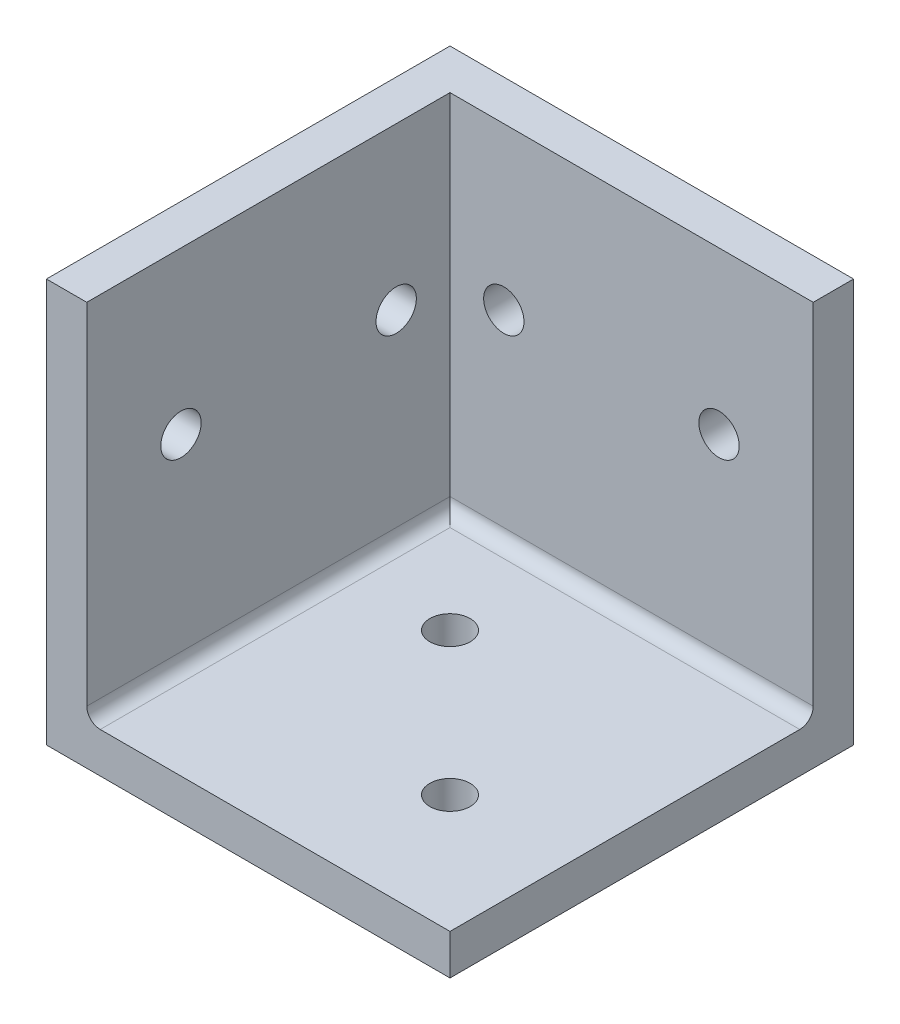
ISO-10303-21;
HEADER;
FILE_DESCRIPTION(('STEP AP214'),'2;1');
FILE_NAME('part.step','',(''),(''),'','','');
FILE_SCHEMA(('AUTOMOTIVE_DESIGN { 1 0 10303 214 1 1 1 1 }'));
ENDSEC;
DATA;
#1=APPLICATION_CONTEXT('core data for automotive mechanical design processes');
#2=APPLICATION_PROTOCOL_DEFINITION('international standard','automotive_design',2000,#1);
#3=PRODUCT_CONTEXT('',#1,'mechanical');
#4=PRODUCT('Part','Part','',(#3));
#5=PRODUCT_RELATED_PRODUCT_CATEGORY('part','',(#4));
#6=PRODUCT_DEFINITION_FORMATION('','',#4);
#7=PRODUCT_DEFINITION_CONTEXT('part definition',#1,'design');
#8=PRODUCT_DEFINITION('design','',#6,#7);
#9=PRODUCT_DEFINITION_SHAPE('','',#8);
#10=(LENGTH_UNIT() NAMED_UNIT(*) SI_UNIT(.MILLI.,.METRE.));
#11=(NAMED_UNIT(*) PLANE_ANGLE_UNIT() SI_UNIT($,.RADIAN.));
#12=(NAMED_UNIT(*) SI_UNIT($,.STERADIAN.) SOLID_ANGLE_UNIT());
#13=UNCERTAINTY_MEASURE_WITH_UNIT(LENGTH_MEASURE(1.E-05),#10,'distance_accuracy_value','');
#14=(GEOMETRIC_REPRESENTATION_CONTEXT(3) GLOBAL_UNCERTAINTY_ASSIGNED_CONTEXT((#13)) GLOBAL_UNIT_ASSIGNED_CONTEXT((#10,
#11,#12)) REPRESENTATION_CONTEXT('',''));
#15=CARTESIAN_POINT('',(0.,0.,0.));
#16=DIRECTION('',(0.,0.,1.));
#17=DIRECTION('',(1.,0.,0.));
#18=AXIS2_PLACEMENT_3D('',#15,#16,#17);
#19=CARTESIAN_POINT('',(-15.,-15.,3.));
#20=DIRECTION('',(1.,0.,0.));
#21=DIRECTION('',(0.,0.,-1.));
#22=AXIS2_PLACEMENT_3D('',#19,#20,#21);
#23=PLANE('',#22);
#24=CARTESIAN_POINT('',(-15.,2.99999999999999,23.));
#25=DIRECTION('',(-1.,0.,0.));
#26=DIRECTION('',(0.,0.,1.));
#27=AXIS2_PLACEMENT_3D('',#24,#25,#26);
#28=CIRCLE('',#27,1.5);
#29=CARTESIAN_POINT('',(-15.,2.99999999999999,24.5));
#30=VERTEX_POINT('',#29);
#31=EDGE_CURVE('E473',#30,#30,#28,.T.);
#32=ORIENTED_EDGE('',*,*,#31,.F.);
#33=EDGE_LOOP('',(#32));
#34=FACE_BOUND('',#33,.T.);
#35=CARTESIAN_POINT('',(-15.,2.99999999999999,7.));
#36=DIRECTION('',(-1.,0.,0.));
#37=DIRECTION('',(0.,0.,-1.));
#38=AXIS2_PLACEMENT_3D('',#35,#36,#37);
#39=CIRCLE('',#38,1.5);
#40=CARTESIAN_POINT('',(-15.,2.99999999999999,5.5));
#41=VERTEX_POINT('',#40);
#42=EDGE_CURVE('E478',#41,#41,#39,.T.);
#43=ORIENTED_EDGE('',*,*,#42,.F.);
#44=EDGE_LOOP('',(#43));
#45=FACE_BOUND('',#44,.T.);
#46=DIRECTION('',(0.,-1.,0.));
#47=VECTOR('',#46,1.);
#48=CARTESIAN_POINT('',(-15.,-15.,0.));
#49=LINE('',#48,#47);
#50=CARTESIAN_POINT('',(-15.,15.,0.));
#51=VERTEX_POINT('',#50);
#52=CARTESIAN_POINT('',(-15.,-15.,0.));
#53=VERTEX_POINT('',#52);
#54=EDGE_CURVE('E160',#51,#53,#49,.T.);
#55=ORIENTED_EDGE('',*,*,#54,.T.);
#56=DIRECTION('',(0.,0.,-1.));
#57=VECTOR('',#56,1.);
#58=CARTESIAN_POINT('',(-15.,-15.,3.));
#59=LINE('',#58,#57);
#60=CARTESIAN_POINT('',(-15.,-15.,30.));
#61=VERTEX_POINT('',#60);
#62=EDGE_CURVE('E200',#61,#53,#59,.T.);
#63=ORIENTED_EDGE('',*,*,#62,.F.);
#64=DIRECTION('',(0.,-1.,0.));
#65=VECTOR('',#64,1.);
#66=CARTESIAN_POINT('',(-15.,-15.,30.));
#67=LINE('',#66,#65);
#68=CARTESIAN_POINT('',(-15.,15.,30.));
#69=VERTEX_POINT('',#68);
#70=EDGE_CURVE('E139',#69,#61,#67,.T.);
#71=ORIENTED_EDGE('',*,*,#70,.F.);
#72=DIRECTION('',(0.,0.,-1.));
#73=VECTOR('',#72,1.);
#74=CARTESIAN_POINT('',(-15.,15.,3.));
#75=LINE('',#74,#73);
#76=EDGE_CURVE('E127',#69,#51,#75,.T.);
#77=ORIENTED_EDGE('',*,*,#76,.T.);
#78=EDGE_LOOP('',(#55,#63,#71,#77));
#79=FACE_BOUND('',#78,.T.);
#80=ADVANCED_FACE('F42',(#34,#45,#79),#23,.F.);
#81=CARTESIAN_POINT('',(15.,-15.,3.));
#82=DIRECTION('',(0.,1.,0.));
#83=DIRECTION('',(-1.,0.,0.));
#84=AXIS2_PLACEMENT_3D('',#81,#82,#83);
#85=PLANE('',#84);
#86=CARTESIAN_POINT('',(-4.39339828220178,-15.,10.6066017177982));
#87=DIRECTION('',(0.,-1.,0.));
#88=DIRECTION('',(1.,0.,0.));
#89=AXIS2_PLACEMENT_3D('',#86,#87,#88);
#90=CIRCLE('',#89,1.5);
#91=CARTESIAN_POINT('',(-2.89339828220178,-15.,10.6066017177982));
#92=VERTEX_POINT('',#91);
#93=EDGE_CURVE('E456',#92,#92,#90,.T.);
#94=ORIENTED_EDGE('',*,*,#93,.F.);
#95=EDGE_LOOP('',(#94));
#96=FACE_BOUND('',#95,.T.);
#97=CARTESIAN_POINT('',(6.21320343559642,-15.,21.2132034355964));
#98=DIRECTION('',(0.,-1.,0.));
#99=DIRECTION('',(1.,0.,0.));
#100=AXIS2_PLACEMENT_3D('',#97,#98,#99);
#101=CIRCLE('',#100,1.5);
#102=CARTESIAN_POINT('',(7.71320343559642,-15.,21.2132034355964));
#103=VERTEX_POINT('',#102);
#104=EDGE_CURVE('E458',#103,#103,#101,.T.);
#105=ORIENTED_EDGE('',*,*,#104,.F.);
#106=EDGE_LOOP('',(#105));
#107=FACE_BOUND('',#106,.T.);
#108=DIRECTION('',(0.,0.,-1.));
#109=VECTOR('',#108,1.);
#110=CARTESIAN_POINT('',(15.,-15.,3.));
#111=LINE('',#110,#109);
#112=CARTESIAN_POINT('',(15.,-15.,30.));
#113=VERTEX_POINT('',#112);
#114=CARTESIAN_POINT('',(15.,-15.,0.));
#115=VERTEX_POINT('',#114);
#116=EDGE_CURVE('E196',#113,#115,#111,.T.);
#117=ORIENTED_EDGE('',*,*,#116,.F.);
#118=DIRECTION('',(1.,0.,0.));
#119=VECTOR('',#118,1.);
#120=CARTESIAN_POINT('',(-15.,-15.,30.));
#121=LINE('',#120,#119);
#122=EDGE_CURVE('E142',#61,#113,#121,.T.);
#123=ORIENTED_EDGE('',*,*,#122,.F.);
#124=ORIENTED_EDGE('',*,*,#62,.T.);
#125=DIRECTION('',(1.,0.,0.));
#126=VECTOR('',#125,1.);
#127=CARTESIAN_POINT('',(15.,-15.,0.));
#128=LINE('',#127,#126);
#129=EDGE_CURVE('E182',#53,#115,#128,.T.);
#130=ORIENTED_EDGE('',*,*,#129,.T.);
#131=EDGE_LOOP('',(#117,#123,#124,#130));
#132=FACE_BOUND('',#131,.T.);
#133=ADVANCED_FACE('F243',(#96,#107,#132),#85,.F.);
#134=CARTESIAN_POINT('',(15.,-15.,3.));
#135=DIRECTION('',(-1.,0.,0.));
#136=DIRECTION('',(0.,0.,1.));
#137=AXIS2_PLACEMENT_3D('',#134,#135,#136);
#138=PLANE('',#137);
#139=DIRECTION('',(0.,1.,0.));
#140=VECTOR('',#139,1.);
#141=CARTESIAN_POINT('',(15.,-15.,0.));
#142=LINE('',#141,#140);
#143=CARTESIAN_POINT('',(15.,15.,0.));
#144=VERTEX_POINT('',#143);
#145=EDGE_CURVE('E185',#115,#144,#142,.T.);
#146=ORIENTED_EDGE('',*,*,#145,.T.);
#147=DIRECTION('',(0.,0.,-1.));
#148=VECTOR('',#147,1.);
#149=CARTESIAN_POINT('',(15.,15.,3.));
#150=LINE('',#149,#148);
#151=CARTESIAN_POINT('',(15.,15.,3.));
#152=VERTEX_POINT('',#151);
#153=EDGE_CURVE('E192',#152,#144,#150,.T.);
#154=ORIENTED_EDGE('',*,*,#153,.F.);
#155=DIRECTION('',(0.,1.,0.));
#156=VECTOR('',#155,1.);
#157=CARTESIAN_POINT('',(15.,-15.,3.));
#158=LINE('',#157,#156);
#159=CARTESIAN_POINT('',(15.,-11.,3.));
#160=VERTEX_POINT('',#159);
#161=EDGE_CURVE('E172',#160,#152,#158,.T.);
#162=ORIENTED_EDGE('',*,*,#161,.F.);
#163=CARTESIAN_POINT('',(15.,-11.,4.));
#164=DIRECTION('',(-1.,0.,0.));
#165=DIRECTION('',(0.,0.,1.));
#166=AXIS2_PLACEMENT_3D('',#163,#164,#165);
#167=CIRCLE('',#166,1.);
#168=CARTESIAN_POINT('',(15.,-12.,4.));
#169=VERTEX_POINT('',#168);
#170=EDGE_CURVE('E52',#160,#169,#167,.T.);
#171=ORIENTED_EDGE('',*,*,#170,.T.);
#172=DIRECTION('',(0.,0.,-1.));
#173=VECTOR('',#172,1.);
#174=CARTESIAN_POINT('',(15.,-12.,30.));
#175=LINE('',#174,#173);
#176=CARTESIAN_POINT('',(15.,-12.,30.));
#177=VERTEX_POINT('',#176);
#178=EDGE_CURVE('E151',#177,#169,#175,.T.);
#179=ORIENTED_EDGE('',*,*,#178,.F.);
#180=DIRECTION('',(0.,1.,0.));
#181=VECTOR('',#180,1.);
#182=CARTESIAN_POINT('',(15.,-15.,30.));
#183=LINE('',#182,#181);
#184=EDGE_CURVE('E145',#113,#177,#183,.T.);
#185=ORIENTED_EDGE('',*,*,#184,.F.);
#186=ORIENTED_EDGE('',*,*,#116,.T.);
#187=EDGE_LOOP('',(#146,#154,#162,#171,#179,#185,#186));
#188=FACE_BOUND('',#187,.T.);
#189=ADVANCED_FACE('F220',(#188),#138,.F.);
#190=CARTESIAN_POINT('',(15.,15.,3.));
#191=DIRECTION('',(0.,-1.,0.));
#192=DIRECTION('',(1.,0.,0.));
#193=AXIS2_PLACEMENT_3D('',#190,#191,#192);
#194=PLANE('',#193);
#195=DIRECTION('',(-1.,0.,0.));
#196=VECTOR('',#195,1.);
#197=CARTESIAN_POINT('',(15.,15.,0.));
#198=LINE('',#197,#196);
#199=EDGE_CURVE('E176',#144,#51,#198,.T.);
#200=ORIENTED_EDGE('',*,*,#199,.T.);
#201=ORIENTED_EDGE('',*,*,#76,.F.);
#202=DIRECTION('',(-1.,0.,0.));
#203=VECTOR('',#202,1.);
#204=CARTESIAN_POINT('',(-12.,15.,30.));
#205=LINE('',#204,#203);
#206=CARTESIAN_POINT('',(-12.,15.,30.));
#207=VERTEX_POINT('',#206);
#208=EDGE_CURVE('E114',#207,#69,#205,.T.);
#209=ORIENTED_EDGE('',*,*,#208,.F.);
#210=DIRECTION('',(0.,0.,-1.));
#211=VECTOR('',#210,1.);
#212=CARTESIAN_POINT('',(-12.,15.,0.));
#213=LINE('',#212,#211);
#214=CARTESIAN_POINT('',(-12.,15.,3.));
#215=VERTEX_POINT('',#214);
#216=EDGE_CURVE('E119',#207,#215,#213,.T.);
#217=ORIENTED_EDGE('',*,*,#216,.T.);
#218=DIRECTION('',(-1.,0.,0.));
#219=VECTOR('',#218,1.);
#220=CARTESIAN_POINT('',(15.,15.,3.));
#221=LINE('',#220,#219);
#222=EDGE_CURVE('E175',#152,#215,#221,.T.);
#223=ORIENTED_EDGE('',*,*,#222,.F.);
#224=ORIENTED_EDGE('',*,*,#153,.T.);
#225=EDGE_LOOP('',(#200,#201,#209,#217,#223,#224));
#226=FACE_BOUND('',#225,.T.);
#227=ADVANCED_FACE('F123',(#226),#194,.F.);
#228=CARTESIAN_POINT('',(0.,0.,3.));
#229=DIRECTION('',(0.,0.,1.));
#230=DIRECTION('',(1.,0.,0.));
#231=AXIS2_PLACEMENT_3D('',#228,#229,#230);
#232=PLANE('',#231);
#233=DIRECTION('',(0.,1.,0.));
#234=VECTOR('',#233,1.);
#235=CARTESIAN_POINT('',(-12.,0.,3.));
#236=LINE('',#235,#234);
#237=CARTESIAN_POINT('',(-12.,-11.,3.));
#238=VERTEX_POINT('',#237);
#239=EDGE_CURVE('E130',#238,#215,#236,.T.);
#240=ORIENTED_EDGE('',*,*,#239,.F.);
#241=DIRECTION('',(-1.,0.,0.));
#242=VECTOR('',#241,1.);
#243=CARTESIAN_POINT('',(0.,-11.,3.));
#244=LINE('',#243,#242);
#245=EDGE_CURVE('E65',#238,#160,#244,.F.);
#246=ORIENTED_EDGE('',*,*,#245,.T.);
#247=ORIENTED_EDGE('',*,*,#161,.T.);
#248=ORIENTED_EDGE('',*,*,#222,.T.);
#249=EDGE_LOOP('',(#240,#246,#247,#248));
#250=FACE_BOUND('',#249,.T.);
#251=CARTESIAN_POINT('',(8.,3.,3.));
#252=DIRECTION('',(0.,0.,1.));
#253=DIRECTION('',(1.,0.,0.));
#254=AXIS2_PLACEMENT_3D('',#251,#252,#253);
#255=CIRCLE('',#254,1.5);
#256=CARTESIAN_POINT('',(9.5,3.,3.));
#257=VERTEX_POINT('',#256);
#258=EDGE_CURVE('E161',#257,#257,#255,.T.);
#259=ORIENTED_EDGE('',*,*,#258,.F.);
#260=EDGE_LOOP('',(#259));
#261=FACE_BOUND('',#260,.T.);
#262=CARTESIAN_POINT('',(-8.,3.,3.));
#263=DIRECTION('',(0.,0.,1.));
#264=DIRECTION('',(-1.,0.,0.));
#265=AXIS2_PLACEMENT_3D('',#262,#263,#264);
#266=CIRCLE('',#265,1.5);
#267=CARTESIAN_POINT('',(-9.5,3.,3.));
#268=VERTEX_POINT('',#267);
#269=EDGE_CURVE('E165',#268,#268,#266,.T.);
#270=ORIENTED_EDGE('',*,*,#269,.F.);
#271=EDGE_LOOP('',(#270));
#272=FACE_BOUND('',#271,.T.);
#273=ADVANCED_FACE('F290',(#250,#261,#272),#232,.T.);
#274=CARTESIAN_POINT('',(0.,0.,0.));
#275=DIRECTION('',(0.,0.,1.));
#276=DIRECTION('',(1.,0.,0.));
#277=AXIS2_PLACEMENT_3D('',#274,#275,#276);
#278=PLANE('',#277);
#279=CARTESIAN_POINT('',(8.,3.,0.));
#280=DIRECTION('',(0.,0.,1.));
#281=DIRECTION('',(1.,0.,0.));
#282=AXIS2_PLACEMENT_3D('',#279,#280,#281);
#283=CIRCLE('',#282,1.5);
#284=CARTESIAN_POINT('',(9.5,3.,0.));
#285=VERTEX_POINT('',#284);
#286=EDGE_CURVE('E156',#285,#285,#283,.T.);
#287=ORIENTED_EDGE('',*,*,#286,.T.);
#288=EDGE_LOOP('',(#287));
#289=FACE_BOUND('',#288,.T.);
#290=CARTESIAN_POINT('',(-8.,3.,0.));
#291=DIRECTION('',(0.,0.,1.));
#292=DIRECTION('',(-1.,0.,0.));
#293=AXIS2_PLACEMENT_3D('',#290,#291,#292);
#294=CIRCLE('',#293,1.5);
#295=CARTESIAN_POINT('',(-9.5,3.,0.));
#296=VERTEX_POINT('',#295);
#297=EDGE_CURVE('E155',#296,#296,#294,.T.);
#298=ORIENTED_EDGE('',*,*,#297,.T.);
#299=EDGE_LOOP('',(#298));
#300=FACE_BOUND('',#299,.T.);
#301=ORIENTED_EDGE('',*,*,#145,.F.);
#302=ORIENTED_EDGE('',*,*,#129,.F.);
#303=ORIENTED_EDGE('',*,*,#54,.F.);
#304=ORIENTED_EDGE('',*,*,#199,.F.);
#305=EDGE_LOOP('',(#301,#302,#303,#304));
#306=FACE_BOUND('',#305,.T.);
#307=ADVANCED_FACE('F240',(#289,#300,#306),#278,.F.);
#308=CARTESIAN_POINT('',(-8.,3.,0.));
#309=DIRECTION('',(0.,0.,1.));
#310=DIRECTION('',(1.,0.,0.));
#311=AXIS2_PLACEMENT_3D('',#308,#309,#310);
#312=CYLINDRICAL_SURFACE('',#311,1.5);
#313=ORIENTED_EDGE('',*,*,#297,.F.);
#314=EDGE_LOOP('',(#313));
#315=FACE_BOUND('',#314,.T.);
#316=ORIENTED_EDGE('',*,*,#269,.T.);
#317=EDGE_LOOP('',(#316));
#318=FACE_BOUND('',#317,.T.);
#319=ADVANCED_FACE('F285',(#315,#318),#312,.F.);
#320=CARTESIAN_POINT('',(8.,3.,0.));
#321=DIRECTION('',(0.,0.,1.));
#322=DIRECTION('',(1.,0.,0.));
#323=AXIS2_PLACEMENT_3D('',#320,#321,#322);
#324=CYLINDRICAL_SURFACE('',#323,1.5);
#325=ORIENTED_EDGE('',*,*,#286,.F.);
#326=EDGE_LOOP('',(#325));
#327=FACE_BOUND('',#326,.T.);
#328=ORIENTED_EDGE('',*,*,#258,.T.);
#329=EDGE_LOOP('',(#328));
#330=FACE_BOUND('',#329,.T.);
#331=ADVANCED_FACE('F281',(#327,#330),#324,.F.);
#332=CARTESIAN_POINT('',(-15.,-12.,30.));
#333=DIRECTION('',(0.,-1.,0.));
#334=DIRECTION('',(0.,0.,-1.));
#335=AXIS2_PLACEMENT_3D('',#332,#333,#334);
#336=PLANE('',#335);
#337=CARTESIAN_POINT('',(-4.39339828220178,-12.,10.6066017177982));
#338=DIRECTION('',(0.,-1.,0.));
#339=DIRECTION('',(1.,0.,0.));
#340=AXIS2_PLACEMENT_3D('',#337,#338,#339);
#341=CIRCLE('',#340,1.5);
#342=CARTESIAN_POINT('',(-2.89339828220178,-12.,10.6066017177982));
#343=VERTEX_POINT('',#342);
#344=EDGE_CURVE('E233',#343,#343,#341,.T.);
#345=ORIENTED_EDGE('',*,*,#344,.T.);
#346=EDGE_LOOP('',(#345));
#347=FACE_BOUND('',#346,.T.);
#348=CARTESIAN_POINT('',(6.21320343559642,-12.,21.2132034355964));
#349=DIRECTION('',(0.,-1.,0.));
#350=DIRECTION('',(1.,0.,0.));
#351=AXIS2_PLACEMENT_3D('',#348,#349,#350);
#352=CIRCLE('',#351,1.5);
#353=CARTESIAN_POINT('',(7.71320343559642,-12.,21.2132034355964));
#354=VERTEX_POINT('',#353);
#355=EDGE_CURVE('E464',#354,#354,#352,.T.);
#356=ORIENTED_EDGE('',*,*,#355,.T.);
#357=EDGE_LOOP('',(#356));
#358=FACE_BOUND('',#357,.T.);
#359=ORIENTED_EDGE('',*,*,#178,.T.);
#360=DIRECTION('',(-1.,0.,0.));
#361=VECTOR('',#360,1.);
#362=CARTESIAN_POINT('',(-15.,-12.,4.));
#363=LINE('',#362,#361);
#364=CARTESIAN_POINT('',(-11.,-12.,4.));
#365=VERTEX_POINT('',#364);
#366=EDGE_CURVE('E207',#169,#365,#363,.T.);
#367=ORIENTED_EDGE('',*,*,#366,.T.);
#368=DIRECTION('',(0.,0.,1.));
#369=VECTOR('',#368,1.);
#370=CARTESIAN_POINT('',(-11.,-12.,30.));
#371=LINE('',#370,#369);
#372=CARTESIAN_POINT('',(-11.,-12.,30.));
#373=VERTEX_POINT('',#372);
#374=EDGE_CURVE('E204',#365,#373,#371,.T.);
#375=ORIENTED_EDGE('',*,*,#374,.T.);
#376=DIRECTION('',(-1.,0.,0.));
#377=VECTOR('',#376,1.);
#378=CARTESIAN_POINT('',(-15.,-12.,30.));
#379=LINE('',#378,#377);
#380=EDGE_CURVE('E148',#177,#373,#379,.T.);
#381=ORIENTED_EDGE('',*,*,#380,.F.);
#382=EDGE_LOOP('',(#359,#367,#375,#381));
#383=FACE_BOUND('',#382,.T.);
#384=ADVANCED_FACE('F227',(#347,#358,#383),#336,.F.);
#385=CARTESIAN_POINT('',(0.,0.,30.));
#386=DIRECTION('',(0.,0.,-1.));
#387=DIRECTION('',(-1.,0.,0.));
#388=AXIS2_PLACEMENT_3D('',#385,#386,#387);
#389=PLANE('',#388);
#390=ORIENTED_EDGE('',*,*,#380,.T.);
#391=CARTESIAN_POINT('',(-11.,-11.,30.));
#392=DIRECTION('',(0.,0.,-1.));
#393=DIRECTION('',(-1.,0.,0.));
#394=AXIS2_PLACEMENT_3D('',#391,#392,#393);
#395=CIRCLE('',#394,1.);
#396=CARTESIAN_POINT('',(-12.,-11.,30.));
#397=VERTEX_POINT('',#396);
#398=EDGE_CURVE('E11',#373,#397,#395,.T.);
#399=ORIENTED_EDGE('',*,*,#398,.T.);
#400=DIRECTION('',(0.,1.,0.));
#401=VECTOR('',#400,1.);
#402=CARTESIAN_POINT('',(-12.,-15.,30.));
#403=LINE('',#402,#401);
#404=EDGE_CURVE('E110',#397,#207,#403,.T.);
#405=ORIENTED_EDGE('',*,*,#404,.T.);
#406=ORIENTED_EDGE('',*,*,#208,.T.);
#407=ORIENTED_EDGE('',*,*,#70,.T.);
#408=ORIENTED_EDGE('',*,*,#122,.T.);
#409=ORIENTED_EDGE('',*,*,#184,.T.);
#410=EDGE_LOOP('',(#390,#399,#405,#406,#407,#408,#409));
#411=FACE_BOUND('',#410,.T.);
#412=ADVANCED_FACE('F112',(#411),#389,.F.);
#413=CARTESIAN_POINT('',(-12.,0.,0.));
#414=DIRECTION('',(1.,0.,0.));
#415=DIRECTION('',(0.,0.,-1.));
#416=AXIS2_PLACEMENT_3D('',#413,#414,#415);
#417=PLANE('',#416);
#418=CARTESIAN_POINT('',(-12.,2.99999999999999,23.));
#419=DIRECTION('',(-1.,0.,0.));
#420=DIRECTION('',(0.,0.,1.));
#421=AXIS2_PLACEMENT_3D('',#418,#419,#420);
#422=CIRCLE('',#421,1.5);
#423=CARTESIAN_POINT('',(-12.,2.99999999999999,24.5));
#424=VERTEX_POINT('',#423);
#425=EDGE_CURVE('E469',#424,#424,#422,.T.);
#426=ORIENTED_EDGE('',*,*,#425,.T.);
#427=EDGE_LOOP('',(#426));
#428=FACE_BOUND('',#427,.T.);
#429=CARTESIAN_POINT('',(-12.,2.99999999999999,7.));
#430=DIRECTION('',(-1.,0.,0.));
#431=DIRECTION('',(0.,0.,-1.));
#432=AXIS2_PLACEMENT_3D('',#429,#430,#431);
#433=CIRCLE('',#432,1.5);
#434=CARTESIAN_POINT('',(-12.,2.99999999999999,5.5));
#435=VERTEX_POINT('',#434);
#436=EDGE_CURVE('E483',#435,#435,#433,.T.);
#437=ORIENTED_EDGE('',*,*,#436,.T.);
#438=EDGE_LOOP('',(#437));
#439=FACE_BOUND('',#438,.T.);
#440=ORIENTED_EDGE('',*,*,#404,.F.);
#441=DIRECTION('',(0.,0.,1.));
#442=VECTOR('',#441,1.);
#443=CARTESIAN_POINT('',(-12.,-11.,0.));
#444=LINE('',#443,#442);
#445=EDGE_CURVE('E213',#397,#238,#444,.F.);
#446=ORIENTED_EDGE('',*,*,#445,.T.);
#447=ORIENTED_EDGE('',*,*,#239,.T.);
#448=ORIENTED_EDGE('',*,*,#216,.F.);
#449=EDGE_LOOP('',(#440,#446,#447,#448));
#450=FACE_BOUND('',#449,.T.);
#451=ADVANCED_FACE('F132',(#428,#439,#450),#417,.T.);
#452=CARTESIAN_POINT('',(-11.,-11.,30.));
#453=DIRECTION('',(0.,0.,1.));
#454=DIRECTION('',(1.,0.,0.));
#455=AXIS2_PLACEMENT_3D('',#452,#453,#454);
#456=CYLINDRICAL_SURFACE('',#455,1.);
#457=ORIENTED_EDGE('',*,*,#398,.F.);
#458=ORIENTED_EDGE('',*,*,#374,.F.);
#459=CARTESIAN_POINT('',(-11.,-11.,4.));
#460=DIRECTION('',(-0.707106781186547,0.,0.707106781186547));
#461=DIRECTION('',(-0.707106781186547,0.,-0.707106781186547));
#462=AXIS2_PLACEMENT_3D('',#459,#460,#461);
#463=ELLIPSE('',#462,1.41421356237309,1.);
#464=EDGE_CURVE('E46',#238,#365,#463,.T.);
#465=ORIENTED_EDGE('',*,*,#464,.F.);
#466=ORIENTED_EDGE('',*,*,#445,.F.);
#467=EDGE_LOOP('',(#457,#458,#465,#466));
#468=FACE_BOUND('',#467,.T.);
#469=ADVANCED_FACE('F44',(#468),#456,.F.);
#470=CARTESIAN_POINT('',(-15.,-11.,4.));
#471=DIRECTION('',(-1.,0.,0.));
#472=DIRECTION('',(0.,0.,1.));
#473=AXIS2_PLACEMENT_3D('',#470,#471,#472);
#474=CYLINDRICAL_SURFACE('',#473,1.);
#475=ORIENTED_EDGE('',*,*,#170,.F.);
#476=ORIENTED_EDGE('',*,*,#245,.F.);
#477=ORIENTED_EDGE('',*,*,#464,.T.);
#478=ORIENTED_EDGE('',*,*,#366,.F.);
#479=EDGE_LOOP('',(#475,#476,#477,#478));
#480=FACE_BOUND('',#479,.T.);
#481=ADVANCED_FACE('F228',(#480),#474,.F.);
#482=CARTESIAN_POINT('',(6.21320343559642,-12.,21.2132034355964));
#483=DIRECTION('',(0.,-1.,0.));
#484=DIRECTION('',(1.,0.,0.));
#485=AXIS2_PLACEMENT_3D('',#482,#483,#484);
#486=CYLINDRICAL_SURFACE('',#485,1.5);
#487=ORIENTED_EDGE('',*,*,#355,.F.);
#488=EDGE_LOOP('',(#487));
#489=FACE_BOUND('',#488,.T.);
#490=ORIENTED_EDGE('',*,*,#104,.T.);
#491=EDGE_LOOP('',(#490));
#492=FACE_BOUND('',#491,.T.);
#493=ADVANCED_FACE('F258',(#489,#492),#486,.F.);
#494=CARTESIAN_POINT('',(-4.39339828220178,-12.,10.6066017177982));
#495=DIRECTION('',(0.,-1.,0.));
#496=DIRECTION('',(1.,0.,0.));
#497=AXIS2_PLACEMENT_3D('',#494,#495,#496);
#498=CYLINDRICAL_SURFACE('',#497,1.5);
#499=ORIENTED_EDGE('',*,*,#344,.F.);
#500=EDGE_LOOP('',(#499));
#501=FACE_BOUND('',#500,.T.);
#502=ORIENTED_EDGE('',*,*,#93,.T.);
#503=EDGE_LOOP('',(#502));
#504=FACE_BOUND('',#503,.T.);
#505=ADVANCED_FACE('F263',(#501,#504),#498,.F.);
#506=CARTESIAN_POINT('',(-12.,2.99999999999999,7.));
#507=DIRECTION('',(-1.,0.,0.));
#508=DIRECTION('',(0.,0.,1.));
#509=AXIS2_PLACEMENT_3D('',#506,#507,#508);
#510=CYLINDRICAL_SURFACE('',#509,1.5);
#511=ORIENTED_EDGE('',*,*,#436,.F.);
#512=EDGE_LOOP('',(#511));
#513=FACE_BOUND('',#512,.T.);
#514=ORIENTED_EDGE('',*,*,#42,.T.);
#515=EDGE_LOOP('',(#514));
#516=FACE_BOUND('',#515,.T.);
#517=ADVANCED_FACE('F414',(#513,#516),#510,.F.);
#518=CARTESIAN_POINT('',(-12.,2.99999999999999,23.));
#519=DIRECTION('',(-1.,0.,0.));
#520=DIRECTION('',(0.,0.,1.));
#521=AXIS2_PLACEMENT_3D('',#518,#519,#520);
#522=CYLINDRICAL_SURFACE('',#521,1.5);
#523=ORIENTED_EDGE('',*,*,#425,.F.);
#524=EDGE_LOOP('',(#523));
#525=FACE_BOUND('',#524,.T.);
#526=ORIENTED_EDGE('',*,*,#31,.T.);
#527=EDGE_LOOP('',(#526));
#528=FACE_BOUND('',#527,.T.);
#529=ADVANCED_FACE('F419',(#525,#528),#522,.F.);
#530=CLOSED_SHELL('',(#80,#133,#189,#227,#273,#307,#319,#331,#384,#412,#451,#469,#481,#493,#505,
#517,#529));
#531=MANIFOLD_SOLID_BREP('B2',#530);
#532=ADVANCED_BREP_SHAPE_REPRESENTATION('',(#18,#531),#14);
#533=SHAPE_DEFINITION_REPRESENTATION(#9,#532);
ENDSEC;
END-ISO-10303-21;
